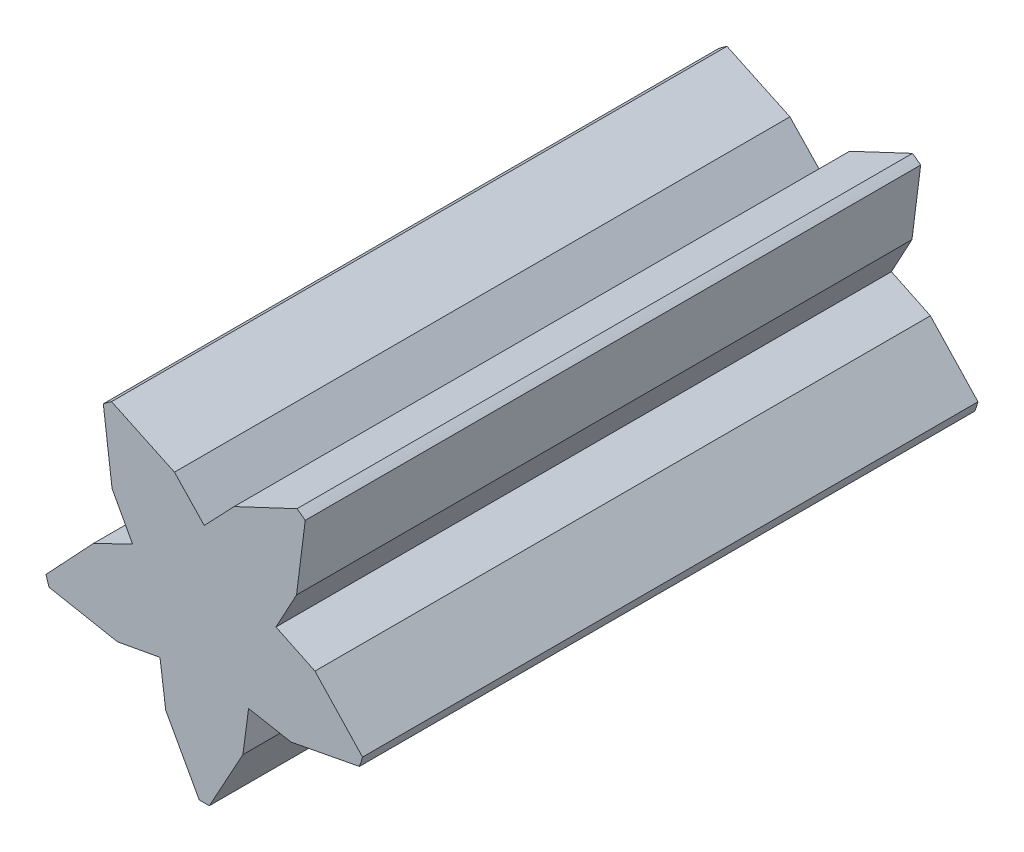
ISO-10303-21;
HEADER;
FILE_DESCRIPTION(('STEP AP214'),'2;1');
FILE_NAME('part.step','',(''),(''),'','','');
FILE_SCHEMA(('AUTOMOTIVE_DESIGN { 1 0 10303 214 1 1 1 1 }'));
ENDSEC;
DATA;
#1=APPLICATION_CONTEXT('core data for automotive mechanical design processes');
#2=APPLICATION_PROTOCOL_DEFINITION('international standard','automotive_design',2000,#1);
#3=PRODUCT_CONTEXT('',#1,'mechanical');
#4=PRODUCT('Part','Part','',(#3));
#5=PRODUCT_RELATED_PRODUCT_CATEGORY('part','',(#4));
#6=PRODUCT_DEFINITION_FORMATION('','',#4);
#7=PRODUCT_DEFINITION_CONTEXT('part definition',#1,'design');
#8=PRODUCT_DEFINITION('design','',#6,#7);
#9=PRODUCT_DEFINITION_SHAPE('','',#8);
#10=(LENGTH_UNIT() NAMED_UNIT(*) SI_UNIT(.MILLI.,.METRE.));
#11=(NAMED_UNIT(*) PLANE_ANGLE_UNIT() SI_UNIT($,.RADIAN.));
#12=(NAMED_UNIT(*) SI_UNIT($,.STERADIAN.) SOLID_ANGLE_UNIT());
#13=UNCERTAINTY_MEASURE_WITH_UNIT(LENGTH_MEASURE(1.E-05),#10,'distance_accuracy_value','');
#14=(GEOMETRIC_REPRESENTATION_CONTEXT(3) GLOBAL_UNCERTAINTY_ASSIGNED_CONTEXT((#13)) GLOBAL_UNIT_ASSIGNED_CONTEXT((#10,
#11,#12)) REPRESENTATION_CONTEXT('',''));
#15=CARTESIAN_POINT('',(0.,0.,0.));
#16=DIRECTION('',(0.,0.,1.));
#17=DIRECTION('',(1.,0.,0.));
#18=AXIS2_PLACEMENT_3D('',#15,#16,#17);
#19=CARTESIAN_POINT('',(0.,0.,28.));
#20=DIRECTION('',(0.,0.,-1.));
#21=DIRECTION('',(-1.,0.,0.));
#22=AXIS2_PLACEMENT_3D('',#19,#20,#21);
#23=CYLINDRICAL_SURFACE('',#22,7.5);
#24=DIRECTION('',(0.,0.,-1.));
#25=VECTOR('',#24,1.);
#26=CARTESIAN_POINT('',(7.20101602130368,-2.09651335815629,28.));
#27=LINE('',#26,#25);
#28=CARTESIAN_POINT('',(7.20101602130368,-2.09651335815629,28.));
#29=VERTEX_POINT('',#28);
#30=CARTESIAN_POINT('',(7.20101602130368,-2.09651335815629,0.));
#31=VERTEX_POINT('',#30);
#32=EDGE_CURVE('E312',#29,#31,#27,.T.);
#33=ORIENTED_EDGE('',*,*,#32,.F.);
#34=CARTESIAN_POINT('',(0.,0.,28.));
#35=DIRECTION('',(0.,0.,1.));
#36=DIRECTION('',(1.,0.,0.));
#37=AXIS2_PLACEMENT_3D('',#34,#35,#36);
#38=CIRCLE('',#37,7.5);
#39=CARTESIAN_POINT('',(7.05804397115943,-2.53653608316145,28.));
#40=VERTEX_POINT('',#39);
#41=EDGE_CURVE('E395',#40,#29,#38,.T.);
#42=ORIENTED_EDGE('',*,*,#41,.F.);
#43=DIRECTION('',(0.,0.,-1.));
#44=VECTOR('',#43,1.);
#45=CARTESIAN_POINT('',(7.05804397115943,-2.53653608316145,28.));
#46=LINE('',#45,#44);
#47=CARTESIAN_POINT('',(7.05804397115943,-2.53653608316145,0.));
#48=VERTEX_POINT('',#47);
#49=EDGE_CURVE('E281',#40,#48,#46,.T.);
#50=ORIENTED_EDGE('',*,*,#49,.T.);
#51=CARTESIAN_POINT('',(0.,0.,0.));
#52=DIRECTION('',(0.,0.,1.));
#53=DIRECTION('',(1.,0.,0.));
#54=AXIS2_PLACEMENT_3D('',#51,#52,#53);
#55=CIRCLE('',#54,7.5);
#56=EDGE_CURVE('E384',#48,#31,#55,.T.);
#57=ORIENTED_EDGE('',*,*,#56,.T.);
#58=EDGE_LOOP('',(#33,#42,#50,#57));
#59=FACE_BOUND('',#58,.T.);
#60=ADVANCED_FACE('F37',(#59),#23,.T.);
#61=DIRECTION('',(0.,0.,-1.));
#62=VECTOR('',#61,1.);
#63=CARTESIAN_POINT('',(4.59344470484238,5.92876595452676,28.));
#64=LINE('',#63,#62);
#65=CARTESIAN_POINT('',(4.59344470484238,5.92876595452676,28.));
#66=VERTEX_POINT('',#65);
#67=CARTESIAN_POINT('',(4.59344470484238,5.92876595452676,0.));
#68=VERTEX_POINT('',#67);
#69=EDGE_CURVE('E309',#66,#68,#64,.T.);
#70=ORIENTED_EDGE('',*,*,#69,.T.);
#71=CARTESIAN_POINT('',(4.21913901812355,6.20071495440223,0.));
#72=VERTEX_POINT('',#71);
#73=EDGE_CURVE('E381',#68,#72,#55,.T.);
#74=ORIENTED_EDGE('',*,*,#73,.T.);
#75=DIRECTION('',(0.,0.,-1.));
#76=VECTOR('',#75,1.);
#77=CARTESIAN_POINT('',(4.21913901812355,6.20071495440223,28.));
#78=LINE('',#77,#76);
#79=CARTESIAN_POINT('',(4.21913901812355,6.20071495440223,28.));
#80=VERTEX_POINT('',#79);
#81=EDGE_CURVE('E376',#80,#72,#78,.T.);
#82=ORIENTED_EDGE('',*,*,#81,.F.);
#83=EDGE_CURVE('E46',#66,#80,#38,.T.);
#84=ORIENTED_EDGE('',*,*,#83,.F.);
#85=EDGE_LOOP('',(#70,#74,#82,#84));
#86=FACE_BOUND('',#85,.T.);
#87=ADVANCED_FACE('F437',(#86),#23,.T.);
#88=DIRECTION('',(0.,0.,-1.));
#89=VECTOR('',#88,1.);
#90=CARTESIAN_POINT('',(0.231333636574714,-7.49643146761105,28.));
#91=LINE('',#90,#89);
#92=CARTESIAN_POINT('',(0.231333636574714,-7.49643146761105,28.));
#93=VERTEX_POINT('',#92);
#94=CARTESIAN_POINT('',(0.231333636574714,-7.49643146761105,0.));
#95=VERTEX_POINT('',#94);
#96=EDGE_CURVE('E284',#93,#95,#91,.T.);
#97=ORIENTED_EDGE('',*,*,#96,.F.);
#98=CARTESIAN_POINT('',(-0.231333636574606,-7.49643146761105,28.));
#99=VERTEX_POINT('',#98);
#100=EDGE_CURVE('E417',#99,#93,#38,.T.);
#101=ORIENTED_EDGE('',*,*,#100,.F.);
#102=DIRECTION('',(0.,0.,-1.));
#103=VECTOR('',#102,1.);
#104=CARTESIAN_POINT('',(-0.231333636574606,-7.49643146761105,28.));
#105=LINE('',#104,#103);
#106=CARTESIAN_POINT('',(-0.231333636574606,-7.49643146761105,0.));
#107=VERTEX_POINT('',#106);
#108=EDGE_CURVE('E254',#99,#107,#105,.T.);
#109=ORIENTED_EDGE('',*,*,#108,.T.);
#110=EDGE_CURVE('E389',#107,#95,#55,.T.);
#111=ORIENTED_EDGE('',*,*,#110,.T.);
#112=EDGE_LOOP('',(#97,#101,#109,#111));
#113=FACE_BOUND('',#112,.T.);
#114=ADVANCED_FACE('F403',(#113),#23,.T.);
#115=DIRECTION('',(0.,0.,-1.));
#116=VECTOR('',#115,1.);
#117=CARTESIAN_POINT('',(-7.05804397115939,-2.53653608316156,28.));
#118=LINE('',#117,#116);
#119=CARTESIAN_POINT('',(-7.05804397115939,-2.53653608316156,28.));
#120=VERTEX_POINT('',#119);
#121=CARTESIAN_POINT('',(-7.05804397115939,-2.53653608316156,0.));
#122=VERTEX_POINT('',#121);
#123=EDGE_CURVE('E229',#120,#122,#118,.T.);
#124=ORIENTED_EDGE('',*,*,#123,.F.);
#125=CARTESIAN_POINT('',(-7.20101602130365,-2.09651335815639,28.));
#126=VERTEX_POINT('',#125);
#127=EDGE_CURVE('E45',#126,#120,#38,.T.);
#128=ORIENTED_EDGE('',*,*,#127,.F.);
#129=DIRECTION('',(0.,0.,-1.));
#130=VECTOR('',#129,1.);
#131=CARTESIAN_POINT('',(-7.20101602130365,-2.09651335815639,28.));
#132=LINE('',#131,#130);
#133=CARTESIAN_POINT('',(-7.20101602130365,-2.09651335815639,0.));
#134=VERTEX_POINT('',#133);
#135=EDGE_CURVE('E339',#126,#134,#132,.T.);
#136=ORIENTED_EDGE('',*,*,#135,.T.);
#137=EDGE_CURVE('E391',#134,#122,#55,.T.);
#138=ORIENTED_EDGE('',*,*,#137,.T.);
#139=EDGE_LOOP('',(#124,#128,#136,#138));
#140=FACE_BOUND('',#139,.T.);
#141=ADVANCED_FACE('F466',(#140),#23,.T.);
#142=DIRECTION('',(0.,0.,-1.));
#143=VECTOR('',#142,1.);
#144=CARTESIAN_POINT('',(-4.59344470484246,5.92876595452669,28.));
#145=LINE('',#144,#143);
#146=CARTESIAN_POINT('',(-4.59344470484246,5.92876595452669,28.));
#147=VERTEX_POINT('',#146);
#148=CARTESIAN_POINT('',(-4.59344470484246,5.92876595452669,0.));
#149=VERTEX_POINT('',#148);
#150=EDGE_CURVE('E342',#147,#149,#145,.T.);
#151=ORIENTED_EDGE('',*,*,#150,.F.);
#152=CARTESIAN_POINT('',(-4.21913901812355,6.20071495440223,28.));
#153=VERTEX_POINT('',#152);
#154=EDGE_CURVE('E11',#153,#147,#38,.T.);
#155=ORIENTED_EDGE('',*,*,#154,.F.);
#156=DIRECTION('',(0.,0.,-1.));
#157=VECTOR('',#156,1.);
#158=CARTESIAN_POINT('',(-4.21913901812355,6.20071495440223,28.));
#159=LINE('',#158,#157);
#160=CARTESIAN_POINT('',(-4.21913901812355,6.20071495440223,0.));
#161=VERTEX_POINT('',#160);
#162=EDGE_CURVE('E373',#153,#161,#159,.T.);
#163=ORIENTED_EDGE('',*,*,#162,.T.);
#164=EDGE_CURVE('E40',#161,#149,#55,.T.);
#165=ORIENTED_EDGE('',*,*,#164,.T.);
#166=EDGE_LOOP('',(#151,#155,#163,#165));
#167=FACE_BOUND('',#166,.T.);
#168=ADVANCED_FACE('F452',(#167),#23,.T.);
#169=CARTESIAN_POINT('',(0.,0.,28.));
#170=DIRECTION('',(0.,0.,1.));
#171=DIRECTION('',(1.,0.,0.));
#172=AXIS2_PLACEMENT_3D('',#169,#170,#171);
#173=PLANE('',#172);
#174=ORIENTED_EDGE('',*,*,#41,.T.);
#175=DIRECTION('',(0.684710829113543,-0.728814846510857,0.));
#176=VECTOR('',#175,1.);
#177=CARTESIAN_POINT('',(5.03450760612941,0.209545536974573,28.));
#178=LINE('',#177,#176);
#179=CARTESIAN_POINT('',(5.03450760612941,0.209545536974573,28.));
#180=VERTEX_POINT('',#179);
#181=EDGE_CURVE('E289',#180,#29,#178,.T.);
#182=ORIENTED_EDGE('',*,*,#181,.F.);
#183=DIRECTION('',(0.901699966110062,-0.432362314635669,0.));
#184=VECTOR('',#183,1.);
#185=CARTESIAN_POINT('',(3.26146463479318,1.05971409841141,28.));
#186=LINE('',#185,#184);
#187=CARTESIAN_POINT('',(3.26146463479318,1.05971409841141,28.));
#188=VERTEX_POINT('',#187);
#189=EDGE_CURVE('E287',#188,#180,#186,.T.);
#190=ORIENTED_EDGE('',*,*,#189,.F.);
#191=DIRECTION('',(-0.47535440422045,-0.879794402339672,0.));
#192=VECTOR('',#191,1.);
#193=CARTESIAN_POINT('',(3.26146463479318,1.05971409841141,28.));
#194=LINE('',#193,#192);
#195=CARTESIAN_POINT('',(4.19616998798593,2.78968342292939,28.));
#196=VERTEX_POINT('',#195);
#197=EDGE_CURVE('E294',#196,#188,#194,.T.);
#198=ORIENTED_EDGE('',*,*,#197,.F.);
#199=DIRECTION('',(-0.12555607855451,-0.992086524017948,0.));
#200=VECTOR('',#199,1.);
#201=CARTESIAN_POINT('',(4.19616998798593,2.78968342292939,28.));
#202=LINE('',#201,#200);
#203=EDGE_CURVE('E292',#66,#196,#202,.T.);
#204=ORIENTED_EDGE('',*,*,#203,.F.);
#205=ORIENTED_EDGE('',*,*,#83,.T.);
#206=DIRECTION('',(0.904731391375453,0.425982522481658,0.));
#207=VECTOR('',#206,1.);
#208=CARTESIAN_POINT('',(1.35645876020374,4.85285439716745,28.));
#209=LINE('',#208,#207);
#210=CARTESIAN_POINT('',(1.35645876020374,4.85285439716745,28.));
#211=VERTEX_POINT('',#210);
#212=EDGE_CURVE('E350',#211,#80,#209,.T.);
#213=ORIENTED_EDGE('',*,*,#212,.F.);
#214=DIRECTION('',(0.68984161009004,0.723960325562376,0.));
#215=VECTOR('',#214,1.);
#216=CARTESIAN_POINT('',(0.,3.4293068591741,28.));
#217=LINE('',#216,#215);
#218=CARTESIAN_POINT('',(0.,3.4293068591741,28.));
#219=VERTEX_POINT('',#218);
#220=EDGE_CURVE('E348',#219,#211,#217,.T.);
#221=ORIENTED_EDGE('',*,*,#220,.F.);
#222=DIRECTION('',(0.68984161009004,-0.723960325562376,0.));
#223=VECTOR('',#222,1.);
#224=CARTESIAN_POINT('',(0.,3.4293068591741,28.));
#225=LINE('',#224,#223);
#226=CARTESIAN_POINT('',(-1.35645876020374,4.85285439716745,28.));
#227=VERTEX_POINT('',#226);
#228=EDGE_CURVE('E356',#227,#219,#225,.T.);
#229=ORIENTED_EDGE('',*,*,#228,.F.);
#230=DIRECTION('',(0.904731391375453,-0.425982522481658,0.));
#231=VECTOR('',#230,1.);
#232=CARTESIAN_POINT('',(-1.35645876020374,4.85285439716745,28.));
#233=LINE('',#232,#231);
#234=EDGE_CURVE('E354',#153,#227,#233,.T.);
#235=ORIENTED_EDGE('',*,*,#234,.F.);
#236=ORIENTED_EDGE('',*,*,#154,.T.);
#237=DIRECTION('',(-0.125556078554524,0.992086524017946,0.));
#238=VECTOR('',#237,1.);
#239=CARTESIAN_POINT('',(-4.19616998798597,2.78968342292934,28.));
#240=LINE('',#239,#238);
#241=CARTESIAN_POINT('',(-4.19616998798597,2.78968342292934,28.));
#242=VERTEX_POINT('',#241);
#243=EDGE_CURVE('E317',#242,#147,#240,.T.);
#244=ORIENTED_EDGE('',*,*,#243,.F.);
#245=DIRECTION('',(-0.475354404220463,0.879794402339665,0.));
#246=VECTOR('',#245,1.);
#247=CARTESIAN_POINT('',(-3.2614646347932,1.05971409841136,28.));
#248=LINE('',#247,#246);
#249=CARTESIAN_POINT('',(-3.2614646347932,1.05971409841136,28.));
#250=VERTEX_POINT('',#249);
#251=EDGE_CURVE('E315',#250,#242,#248,.T.);
#252=ORIENTED_EDGE('',*,*,#251,.F.);
#253=DIRECTION('',(0.901699966110056,0.432362314635682,0.));
#254=VECTOR('',#253,1.);
#255=CARTESIAN_POINT('',(-3.2614646347932,1.05971409841136,28.));
#256=LINE('',#255,#254);
#257=CARTESIAN_POINT('',(-5.03450760612942,0.209545536974502,28.));
#258=VERTEX_POINT('',#257);
#259=EDGE_CURVE('E322',#258,#250,#256,.T.);
#260=ORIENTED_EDGE('',*,*,#259,.F.);
#261=DIRECTION('',(0.684710829113533,0.728814846510867,0.));
#262=VECTOR('',#261,1.);
#263=CARTESIAN_POINT('',(-5.03450760612942,0.209545536974502,28.));
#264=LINE('',#263,#262);
#265=EDGE_CURVE('E320',#126,#258,#264,.T.);
#266=ORIENTED_EDGE('',*,*,#265,.F.);
#267=ORIENTED_EDGE('',*,*,#127,.T.);
#268=DIRECTION('',(-0.9823293154163,0.187160669142166,0.));
#269=VECTOR('',#268,1.);
#270=CARTESIAN_POINT('',(-3.94983443535129,-3.12873522394498,28.));
#271=LINE('',#270,#269);
#272=CARTESIAN_POINT('',(-3.94983443535129,-3.12873522394498,28.));
#273=VERTEX_POINT('',#272);
#274=EDGE_CURVE('E220',#273,#120,#271,.T.);
#275=ORIENTED_EDGE('',*,*,#274,.F.);
#276=DIRECTION('',(-0.98362678860024,-0.180217481804568,0.));
#277=VECTOR('',#276,1.);
#278=CARTESIAN_POINT('',(-2.01569599740794,-2.77436752799844,28.));
#279=LINE('',#278,#277);
#280=CARTESIAN_POINT('',(-2.01569599740794,-2.77436752799844,28.));
#281=VERTEX_POINT('',#280);
#282=EDGE_CURVE('E210',#281,#273,#279,.T.);
#283=ORIENTED_EDGE('',*,*,#282,.F.);
#284=DIRECTION('',(-0.132560383379402,0.991174931461801,0.));
#285=VECTOR('',#284,1.);
#286=CARTESIAN_POINT('',(-2.01569599740794,-2.77436752799844,28.));
#287=LINE('',#286,#285);
#288=CARTESIAN_POINT('',(-1.75503805700408,-4.72334813312636,28.));
#289=VERTEX_POINT('',#288);
#290=EDGE_CURVE('E238',#289,#281,#287,.T.);
#291=ORIENTED_EDGE('',*,*,#290,.F.);
#292=DIRECTION('',(-0.481556826518173,0.876414869130908,0.));
#293=VECTOR('',#292,1.);
#294=CARTESIAN_POINT('',(-1.75503805700408,-4.72334813312636,28.));
#295=LINE('',#294,#293);
#296=EDGE_CURVE('E236',#99,#289,#295,.T.);
#297=ORIENTED_EDGE('',*,*,#296,.F.);
#298=ORIENTED_EDGE('',*,*,#100,.T.);
#299=DIRECTION('',(-0.48155682651816,-0.876414869130915,0.));
#300=VECTOR('',#299,1.);
#301=CARTESIAN_POINT('',(1.75503805700415,-4.72334813312633,28.));
#302=LINE('',#301,#300);
#303=CARTESIAN_POINT('',(1.75503805700415,-4.72334813312633,28.));
#304=VERTEX_POINT('',#303);
#305=EDGE_CURVE('E260',#304,#93,#302,.T.);
#306=ORIENTED_EDGE('',*,*,#305,.F.);
#307=DIRECTION('',(-0.132560383379387,-0.991174931461803,0.));
#308=VECTOR('',#307,1.);
#309=CARTESIAN_POINT('',(2.01569599740798,-2.77436752799841,28.));
#310=LINE('',#309,#308);
#311=CARTESIAN_POINT('',(2.01569599740798,-2.77436752799841,28.));
#312=VERTEX_POINT('',#311);
#313=EDGE_CURVE('E258',#312,#304,#310,.T.);
#314=ORIENTED_EDGE('',*,*,#313,.F.);
#315=DIRECTION('',(-0.983626788600242,0.180217481804553,0.));
#316=VECTOR('',#315,1.);
#317=CARTESIAN_POINT('',(2.01569599740798,-2.77436752799841,28.));
#318=LINE('',#317,#316);
#319=CARTESIAN_POINT('',(3.94983443535133,-3.12873522394493,28.));
#320=VERTEX_POINT('',#319);
#321=EDGE_CURVE('E265',#320,#312,#318,.T.);
#322=ORIENTED_EDGE('',*,*,#321,.F.);
#323=DIRECTION('',(-0.982329315416297,-0.18716066914218,0.));
#324=VECTOR('',#323,1.);
#325=CARTESIAN_POINT('',(3.94983443535133,-3.12873522394493,28.));
#326=LINE('',#325,#324);
#327=EDGE_CURVE('E263',#40,#320,#326,.T.);
#328=ORIENTED_EDGE('',*,*,#327,.F.);
#329=EDGE_LOOP('',(#174,#182,#190,#198,#204,#205,#213,#221,#229,#235,#236,#244,#252,#260,#266,
#267,#275,#283,#291,#297,#298,#306,#314,#322,#328));
#330=FACE_BOUND('',#329,.T.);
#331=ADVANCED_FACE('F233',(#330),#173,.T.);
#332=CARTESIAN_POINT('',(0.,0.,0.));
#333=DIRECTION('',(0.,0.,1.));
#334=DIRECTION('',(1.,0.,0.));
#335=AXIS2_PLACEMENT_3D('',#332,#333,#334);
#336=PLANE('',#335);
#337=DIRECTION('',(0.684710829113543,-0.728814846510857,0.));
#338=VECTOR('',#337,1.);
#339=CARTESIAN_POINT('',(5.03450760612941,0.209545536974573,0.));
#340=LINE('',#339,#338);
#341=CARTESIAN_POINT('',(5.03450760612941,0.209545536974573,0.));
#342=VERTEX_POINT('',#341);
#343=EDGE_CURVE('E298',#342,#31,#340,.T.);
#344=ORIENTED_EDGE('',*,*,#343,.T.);
#345=ORIENTED_EDGE('',*,*,#56,.F.);
#346=DIRECTION('',(-0.982329315416297,-0.18716066914218,0.));
#347=VECTOR('',#346,1.);
#348=CARTESIAN_POINT('',(3.94983443535133,-3.12873522394493,0.));
#349=LINE('',#348,#347);
#350=CARTESIAN_POINT('',(3.94983443535133,-3.12873522394493,0.));
#351=VERTEX_POINT('',#350);
#352=EDGE_CURVE('E273',#48,#351,#349,.T.);
#353=ORIENTED_EDGE('',*,*,#352,.T.);
#354=DIRECTION('',(-0.983626788600242,0.180217481804553,0.));
#355=VECTOR('',#354,1.);
#356=CARTESIAN_POINT('',(2.01569599740798,-2.77436752799841,0.));
#357=LINE('',#356,#355);
#358=CARTESIAN_POINT('',(2.01569599740798,-2.77436752799841,0.));
#359=VERTEX_POINT('',#358);
#360=EDGE_CURVE('E261',#351,#359,#357,.T.);
#361=ORIENTED_EDGE('',*,*,#360,.T.);
#362=DIRECTION('',(-0.132560383379387,-0.991174931461803,0.));
#363=VECTOR('',#362,1.);
#364=CARTESIAN_POINT('',(2.01569599740798,-2.77436752799841,0.));
#365=LINE('',#364,#363);
#366=CARTESIAN_POINT('',(1.75503805700415,-4.72334813312633,0.));
#367=VERTEX_POINT('',#366);
#368=EDGE_CURVE('E61',#359,#367,#365,.T.);
#369=ORIENTED_EDGE('',*,*,#368,.T.);
#370=DIRECTION('',(-0.48155682651816,-0.876414869130915,0.));
#371=VECTOR('',#370,1.);
#372=CARTESIAN_POINT('',(1.75503805700415,-4.72334813312633,0.));
#373=LINE('',#372,#371);
#374=EDGE_CURVE('E269',#367,#95,#373,.T.);
#375=ORIENTED_EDGE('',*,*,#374,.T.);
#376=ORIENTED_EDGE('',*,*,#110,.F.);
#377=DIRECTION('',(-0.481556826518173,0.876414869130908,0.));
#378=VECTOR('',#377,1.);
#379=CARTESIAN_POINT('',(-1.75503805700408,-4.72334813312636,0.));
#380=LINE('',#379,#378);
#381=CARTESIAN_POINT('',(-1.75503805700408,-4.72334813312636,0.));
#382=VERTEX_POINT('',#381);
#383=EDGE_CURVE('E246',#107,#382,#380,.T.);
#384=ORIENTED_EDGE('',*,*,#383,.T.);
#385=DIRECTION('',(-0.132560383379402,0.991174931461801,0.));
#386=VECTOR('',#385,1.);
#387=CARTESIAN_POINT('',(-2.01569599740794,-2.77436752799844,0.));
#388=LINE('',#387,#386);
#389=CARTESIAN_POINT('',(-2.01569599740794,-2.77436752799844,0.));
#390=VERTEX_POINT('',#389);
#391=EDGE_CURVE('E221',#382,#390,#388,.T.);
#392=ORIENTED_EDGE('',*,*,#391,.T.);
#393=DIRECTION('',(-0.98362678860024,-0.180217481804568,0.));
#394=VECTOR('',#393,1.);
#395=CARTESIAN_POINT('',(-2.01569599740794,-2.77436752799844,0.));
#396=LINE('',#395,#394);
#397=CARTESIAN_POINT('',(-3.94983443535129,-3.12873522394498,0.));
#398=VERTEX_POINT('',#397);
#399=EDGE_CURVE('E242',#390,#398,#396,.T.);
#400=ORIENTED_EDGE('',*,*,#399,.T.);
#401=DIRECTION('',(-0.9823293154163,0.187160669142166,0.));
#402=VECTOR('',#401,1.);
#403=CARTESIAN_POINT('',(-3.94983443535129,-3.12873522394498,0.));
#404=LINE('',#403,#402);
#405=EDGE_CURVE('E227',#398,#122,#404,.T.);
#406=ORIENTED_EDGE('',*,*,#405,.T.);
#407=ORIENTED_EDGE('',*,*,#137,.F.);
#408=DIRECTION('',(0.684710829113533,0.728814846510867,0.));
#409=VECTOR('',#408,1.);
#410=CARTESIAN_POINT('',(-5.03450760612942,0.209545536974502,0.));
#411=LINE('',#410,#409);
#412=CARTESIAN_POINT('',(-5.03450760612942,0.209545536974502,0.));
#413=VERTEX_POINT('',#412);
#414=EDGE_CURVE('E330',#134,#413,#411,.T.);
#415=ORIENTED_EDGE('',*,*,#414,.T.);
#416=DIRECTION('',(0.901699966110056,0.432362314635682,0.));
#417=VECTOR('',#416,1.);
#418=CARTESIAN_POINT('',(-3.2614646347932,1.05971409841136,0.));
#419=LINE('',#418,#417);
#420=CARTESIAN_POINT('',(-3.2614646347932,1.05971409841136,0.));
#421=VERTEX_POINT('',#420);
#422=EDGE_CURVE('E318',#413,#421,#419,.T.);
#423=ORIENTED_EDGE('',*,*,#422,.T.);
#424=DIRECTION('',(-0.475354404220463,0.879794402339665,0.));
#425=VECTOR('',#424,1.);
#426=CARTESIAN_POINT('',(-3.2614646347932,1.05971409841136,0.));
#427=LINE('',#426,#425);
#428=CARTESIAN_POINT('',(-4.19616998798597,2.78968342292934,0.));
#429=VERTEX_POINT('',#428);
#430=EDGE_CURVE('E228',#421,#429,#427,.T.);
#431=ORIENTED_EDGE('',*,*,#430,.T.);
#432=DIRECTION('',(-0.125556078554524,0.992086524017946,0.));
#433=VECTOR('',#432,1.);
#434=CARTESIAN_POINT('',(-4.19616998798597,2.78968342292934,0.));
#435=LINE('',#434,#433);
#436=EDGE_CURVE('E327',#429,#149,#435,.T.);
#437=ORIENTED_EDGE('',*,*,#436,.T.);
#438=ORIENTED_EDGE('',*,*,#164,.F.);
#439=DIRECTION('',(0.904731391375453,-0.425982522481658,0.));
#440=VECTOR('',#439,1.);
#441=CARTESIAN_POINT('',(-1.35645876020374,4.85285439716745,0.));
#442=LINE('',#441,#440);
#443=CARTESIAN_POINT('',(-1.35645876020374,4.85285439716745,0.));
#444=VERTEX_POINT('',#443);
#445=EDGE_CURVE('E364',#161,#444,#442,.T.);
#446=ORIENTED_EDGE('',*,*,#445,.T.);
#447=DIRECTION('',(0.68984161009004,-0.723960325562376,0.));
#448=VECTOR('',#447,1.);
#449=CARTESIAN_POINT('',(0.,3.4293068591741,0.));
#450=LINE('',#449,#448);
#451=CARTESIAN_POINT('',(0.,3.4293068591741,0.));
#452=VERTEX_POINT('',#451);
#453=EDGE_CURVE('E351',#444,#452,#450,.T.);
#454=ORIENTED_EDGE('',*,*,#453,.T.);
#455=DIRECTION('',(0.68984161009004,0.723960325562376,0.));
#456=VECTOR('',#455,1.);
#457=CARTESIAN_POINT('',(0.,3.4293068591741,0.));
#458=LINE('',#457,#456);
#459=CARTESIAN_POINT('',(1.35645876020374,4.85285439716745,0.));
#460=VERTEX_POINT('',#459);
#461=EDGE_CURVE('E347',#452,#460,#458,.T.);
#462=ORIENTED_EDGE('',*,*,#461,.T.);
#463=DIRECTION('',(0.904731391375453,0.425982522481658,0.));
#464=VECTOR('',#463,1.);
#465=CARTESIAN_POINT('',(1.35645876020374,4.85285439716745,0.));
#466=LINE('',#465,#464);
#467=EDGE_CURVE('E361',#460,#72,#466,.T.);
#468=ORIENTED_EDGE('',*,*,#467,.T.);
#469=ORIENTED_EDGE('',*,*,#73,.F.);
#470=DIRECTION('',(-0.12555607855451,-0.992086524017948,0.));
#471=VECTOR('',#470,1.);
#472=CARTESIAN_POINT('',(4.19616998798593,2.78968342292939,0.));
#473=LINE('',#472,#471);
#474=CARTESIAN_POINT('',(4.19616998798593,2.78968342292939,0.));
#475=VERTEX_POINT('',#474);
#476=EDGE_CURVE('E301',#68,#475,#473,.T.);
#477=ORIENTED_EDGE('',*,*,#476,.T.);
#478=DIRECTION('',(-0.47535440422045,-0.879794402339672,0.));
#479=VECTOR('',#478,1.);
#480=CARTESIAN_POINT('',(3.26146463479318,1.05971409841141,0.));
#481=LINE('',#480,#479);
#482=CARTESIAN_POINT('',(3.26146463479319,1.05971409841141,0.));
#483=VERTEX_POINT('',#482);
#484=EDGE_CURVE('E290',#475,#483,#481,.T.);
#485=ORIENTED_EDGE('',*,*,#484,.T.);
#486=DIRECTION('',(0.901699966110062,-0.432362314635669,0.));
#487=VECTOR('',#486,1.);
#488=CARTESIAN_POINT('',(3.26146463479318,1.05971409841141,0.));
#489=LINE('',#488,#487);
#490=EDGE_CURVE('E53',#483,#342,#489,.T.);
#491=ORIENTED_EDGE('',*,*,#490,.T.);
#492=EDGE_LOOP('',(#344,#345,#353,#361,#369,#375,#376,#384,#392,#400,#406,#407,#415,#423,#431,
#437,#438,#446,#454,#462,#468,#469,#477,#485,#491));
#493=FACE_BOUND('',#492,.T.);
#494=ADVANCED_FACE('F407',(#493),#336,.F.);
#495=CARTESIAN_POINT('',(0.,3.4293068591741,28.));
#496=DIRECTION('',(-0.723960325562376,0.68984161009004,0.));
#497=DIRECTION('',(-0.68984161009004,-0.723960325562376,0.));
#498=AXIS2_PLACEMENT_3D('',#495,#496,#497);
#499=PLANE('',#498);
#500=ORIENTED_EDGE('',*,*,#461,.F.);
#501=DIRECTION('',(0.,0.,-1.));
#502=VECTOR('',#501,1.);
#503=CARTESIAN_POINT('',(0.,3.4293068591741,28.));
#504=LINE('',#503,#502);
#505=EDGE_CURVE('E358',#219,#452,#504,.T.);
#506=ORIENTED_EDGE('',*,*,#505,.F.);
#507=ORIENTED_EDGE('',*,*,#220,.T.);
#508=DIRECTION('',(0.,0.,-1.));
#509=VECTOR('',#508,1.);
#510=CARTESIAN_POINT('',(1.35645876020374,4.85285439716745,28.));
#511=LINE('',#510,#509);
#512=EDGE_CURVE('E379',#211,#460,#511,.T.);
#513=ORIENTED_EDGE('',*,*,#512,.T.);
#514=EDGE_LOOP('',(#500,#506,#507,#513));
#515=FACE_BOUND('',#514,.T.);
#516=ADVANCED_FACE('F442',(#515),#499,.T.);
#517=CARTESIAN_POINT('',(1.35645876020374,4.85285439716745,28.));
#518=DIRECTION('',(-0.425982522481658,0.904731391375453,0.));
#519=DIRECTION('',(-0.904731391375453,-0.425982522481659,0.));
#520=AXIS2_PLACEMENT_3D('',#517,#518,#519);
#521=PLANE('',#520);
#522=ORIENTED_EDGE('',*,*,#467,.F.);
#523=ORIENTED_EDGE('',*,*,#512,.F.);
#524=ORIENTED_EDGE('',*,*,#212,.T.);
#525=ORIENTED_EDGE('',*,*,#81,.T.);
#526=EDGE_LOOP('',(#522,#523,#524,#525));
#527=FACE_BOUND('',#526,.T.);
#528=ADVANCED_FACE('F439',(#527),#521,.T.);
#529=CARTESIAN_POINT('',(-1.35645876020374,4.85285439716745,28.));
#530=DIRECTION('',(0.425982522481658,0.904731391375453,0.));
#531=DIRECTION('',(-0.904731391375453,0.425982522481659,0.));
#532=AXIS2_PLACEMENT_3D('',#529,#530,#531);
#533=PLANE('',#532);
#534=ORIENTED_EDGE('',*,*,#445,.F.);
#535=ORIENTED_EDGE('',*,*,#162,.F.);
#536=ORIENTED_EDGE('',*,*,#234,.T.);
#537=DIRECTION('',(0.,0.,-1.));
#538=VECTOR('',#537,1.);
#539=CARTESIAN_POINT('',(-1.35645876020374,4.85285439716745,28.));
#540=LINE('',#539,#538);
#541=EDGE_CURVE('E371',#227,#444,#540,.T.);
#542=ORIENTED_EDGE('',*,*,#541,.T.);
#543=EDGE_LOOP('',(#534,#535,#536,#542));
#544=FACE_BOUND('',#543,.T.);
#545=ADVANCED_FACE('F514',(#544),#533,.T.);
#546=CARTESIAN_POINT('',(0.,3.4293068591741,28.));
#547=DIRECTION('',(0.723960325562376,0.68984161009004,0.));
#548=DIRECTION('',(-0.68984161009004,0.723960325562376,0.));
#549=AXIS2_PLACEMENT_3D('',#546,#547,#548);
#550=PLANE('',#549);
#551=ORIENTED_EDGE('',*,*,#453,.F.);
#552=ORIENTED_EDGE('',*,*,#541,.F.);
#553=ORIENTED_EDGE('',*,*,#228,.T.);
#554=ORIENTED_EDGE('',*,*,#505,.T.);
#555=EDGE_LOOP('',(#551,#552,#553,#554));
#556=FACE_BOUND('',#555,.T.);
#557=ADVANCED_FACE('F445',(#556),#550,.T.);
#558=CARTESIAN_POINT('',(-3.2614646347932,1.05971409841136,28.));
#559=DIRECTION('',(-0.879794402339665,-0.475354404220463,0.));
#560=DIRECTION('',(0.475354404220463,-0.879794402339665,0.));
#561=AXIS2_PLACEMENT_3D('',#558,#559,#560);
#562=PLANE('',#561);
#563=ORIENTED_EDGE('',*,*,#430,.F.);
#564=DIRECTION('',(0.,0.,-1.));
#565=VECTOR('',#564,1.);
#566=CARTESIAN_POINT('',(-3.2614646347932,1.05971409841136,28.));
#567=LINE('',#566,#565);
#568=EDGE_CURVE('E324',#250,#421,#567,.T.);
#569=ORIENTED_EDGE('',*,*,#568,.F.);
#570=ORIENTED_EDGE('',*,*,#251,.T.);
#571=DIRECTION('',(0.,0.,-1.));
#572=VECTOR('',#571,1.);
#573=CARTESIAN_POINT('',(-4.19616998798597,2.78968342292934,28.));
#574=LINE('',#573,#572);
#575=EDGE_CURVE('E344',#242,#429,#574,.T.);
#576=ORIENTED_EDGE('',*,*,#575,.T.);
#577=EDGE_LOOP('',(#563,#569,#570,#576));
#578=FACE_BOUND('',#577,.T.);
#579=ADVANCED_FACE('F459',(#578),#562,.T.);
#580=CARTESIAN_POINT('',(-4.19616998798597,2.78968342292934,28.));
#581=DIRECTION('',(-0.992086524017946,-0.125556078554524,0.));
#582=DIRECTION('',(0.125556078554524,-0.992086524017946,0.));
#583=AXIS2_PLACEMENT_3D('',#580,#581,#582);
#584=PLANE('',#583);
#585=ORIENTED_EDGE('',*,*,#436,.F.);
#586=ORIENTED_EDGE('',*,*,#575,.F.);
#587=ORIENTED_EDGE('',*,*,#243,.T.);
#588=ORIENTED_EDGE('',*,*,#150,.T.);
#589=EDGE_LOOP('',(#585,#586,#587,#588));
#590=FACE_BOUND('',#589,.T.);
#591=ADVANCED_FACE('F454',(#590),#584,.T.);
#592=CARTESIAN_POINT('',(-5.03450760612942,0.209545536974502,28.));
#593=DIRECTION('',(-0.728814846510867,0.684710829113533,0.));
#594=DIRECTION('',(-0.684710829113533,-0.728814846510867,0.));
#595=AXIS2_PLACEMENT_3D('',#592,#593,#594);
#596=PLANE('',#595);
#597=ORIENTED_EDGE('',*,*,#414,.F.);
#598=ORIENTED_EDGE('',*,*,#135,.F.);
#599=ORIENTED_EDGE('',*,*,#265,.T.);
#600=DIRECTION('',(0.,0.,-1.));
#601=VECTOR('',#600,1.);
#602=CARTESIAN_POINT('',(-5.03450760612942,0.209545536974502,28.));
#603=LINE('',#602,#601);
#604=EDGE_CURVE('E337',#258,#413,#603,.T.);
#605=ORIENTED_EDGE('',*,*,#604,.T.);
#606=EDGE_LOOP('',(#597,#598,#599,#605));
#607=FACE_BOUND('',#606,.T.);
#608=ADVANCED_FACE('F577',(#607),#596,.T.);
#609=CARTESIAN_POINT('',(-3.2614646347932,1.05971409841136,28.));
#610=DIRECTION('',(-0.432362314635681,0.901699966110056,0.));
#611=DIRECTION('',(-0.901699966110056,-0.432362314635681,0.));
#612=AXIS2_PLACEMENT_3D('',#609,#610,#611);
#613=PLANE('',#612);
#614=ORIENTED_EDGE('',*,*,#422,.F.);
#615=ORIENTED_EDGE('',*,*,#604,.F.);
#616=ORIENTED_EDGE('',*,*,#259,.T.);
#617=ORIENTED_EDGE('',*,*,#568,.T.);
#618=EDGE_LOOP('',(#614,#615,#616,#617));
#619=FACE_BOUND('',#618,.T.);
#620=ADVANCED_FACE('F462',(#619),#613,.T.);
#621=CARTESIAN_POINT('',(-2.01569599740794,-2.77436752799844,28.));
#622=DIRECTION('',(0.180217481804568,-0.98362678860024,0.));
#623=DIRECTION('',(0.98362678860024,0.180217481804568,0.));
#624=AXIS2_PLACEMENT_3D('',#621,#622,#623);
#625=PLANE('',#624);
#626=ORIENTED_EDGE('',*,*,#399,.F.);
#627=DIRECTION('',(0.,0.,-1.));
#628=VECTOR('',#627,1.);
#629=CARTESIAN_POINT('',(-2.01569599740794,-2.77436752799844,28.));
#630=LINE('',#629,#628);
#631=EDGE_CURVE('E216',#281,#390,#630,.T.);
#632=ORIENTED_EDGE('',*,*,#631,.F.);
#633=ORIENTED_EDGE('',*,*,#282,.T.);
#634=DIRECTION('',(0.,0.,-1.));
#635=VECTOR('',#634,1.);
#636=CARTESIAN_POINT('',(-3.94983443535129,-3.12873522394498,28.));
#637=LINE('',#636,#635);
#638=EDGE_CURVE('E213',#273,#398,#637,.T.);
#639=ORIENTED_EDGE('',*,*,#638,.T.);
#640=EDGE_LOOP('',(#626,#632,#633,#639));
#641=FACE_BOUND('',#640,.T.);
#642=ADVANCED_FACE('F212',(#641),#625,.T.);
#643=CARTESIAN_POINT('',(-3.94983443535129,-3.12873522394498,28.));
#644=DIRECTION('',(-0.187160669142166,-0.9823293154163,0.));
#645=DIRECTION('',(0.9823293154163,-0.187160669142166,0.));
#646=AXIS2_PLACEMENT_3D('',#643,#644,#645);
#647=PLANE('',#646);
#648=ORIENTED_EDGE('',*,*,#405,.F.);
#649=ORIENTED_EDGE('',*,*,#638,.F.);
#650=ORIENTED_EDGE('',*,*,#274,.T.);
#651=ORIENTED_EDGE('',*,*,#123,.T.);
#652=EDGE_LOOP('',(#648,#649,#650,#651));
#653=FACE_BOUND('',#652,.T.);
#654=ADVANCED_FACE('F224',(#653),#647,.T.);
#655=CARTESIAN_POINT('',(-1.75503805700408,-4.72334813312636,28.));
#656=DIRECTION('',(-0.876414869130908,-0.481556826518173,0.));
#657=DIRECTION('',(0.481556826518173,-0.876414869130908,0.));
#658=AXIS2_PLACEMENT_3D('',#655,#656,#657);
#659=PLANE('',#658);
#660=ORIENTED_EDGE('',*,*,#383,.F.);
#661=ORIENTED_EDGE('',*,*,#108,.F.);
#662=ORIENTED_EDGE('',*,*,#296,.T.);
#663=DIRECTION('',(0.,0.,-1.));
#664=VECTOR('',#663,1.);
#665=CARTESIAN_POINT('',(-1.75503805700408,-4.72334813312636,28.));
#666=LINE('',#665,#664);
#667=EDGE_CURVE('E252',#289,#382,#666,.T.);
#668=ORIENTED_EDGE('',*,*,#667,.T.);
#669=EDGE_LOOP('',(#660,#661,#662,#668));
#670=FACE_BOUND('',#669,.T.);
#671=ADVANCED_FACE('F472',(#670),#659,.T.);
#672=CARTESIAN_POINT('',(-2.01569599740794,-2.77436752799844,28.));
#673=DIRECTION('',(-0.991174931461801,-0.132560383379402,0.));
#674=DIRECTION('',(0.132560383379402,-0.991174931461801,0.));
#675=AXIS2_PLACEMENT_3D('',#672,#673,#674);
#676=PLANE('',#675);
#677=ORIENTED_EDGE('',*,*,#391,.F.);
#678=ORIENTED_EDGE('',*,*,#667,.F.);
#679=ORIENTED_EDGE('',*,*,#290,.T.);
#680=ORIENTED_EDGE('',*,*,#631,.T.);
#681=EDGE_LOOP('',(#677,#678,#679,#680));
#682=FACE_BOUND('',#681,.T.);
#683=ADVANCED_FACE('F469',(#682),#676,.T.);
#684=CARTESIAN_POINT('',(2.01569599740798,-2.77436752799841,28.));
#685=DIRECTION('',(0.991174931461803,-0.132560383379387,0.));
#686=DIRECTION('',(0.132560383379387,0.991174931461803,0.));
#687=AXIS2_PLACEMENT_3D('',#684,#685,#686);
#688=PLANE('',#687);
#689=ORIENTED_EDGE('',*,*,#368,.F.);
#690=DIRECTION('',(0.,0.,-1.));
#691=VECTOR('',#690,1.);
#692=CARTESIAN_POINT('',(2.01569599740798,-2.77436752799841,28.));
#693=LINE('',#692,#691);
#694=EDGE_CURVE('E267',#312,#359,#693,.T.);
#695=ORIENTED_EDGE('',*,*,#694,.F.);
#696=ORIENTED_EDGE('',*,*,#313,.T.);
#697=DIRECTION('',(0.,0.,-1.));
#698=VECTOR('',#697,1.);
#699=CARTESIAN_POINT('',(1.75503805700415,-4.72334813312633,28.));
#700=LINE('',#699,#698);
#701=EDGE_CURVE('E244',#304,#367,#700,.T.);
#702=ORIENTED_EDGE('',*,*,#701,.T.);
#703=EDGE_LOOP('',(#689,#695,#696,#702));
#704=FACE_BOUND('',#703,.T.);
#705=ADVANCED_FACE('F412',(#704),#688,.T.);
#706=CARTESIAN_POINT('',(1.75503805700415,-4.72334813312633,28.));
#707=DIRECTION('',(0.876414869130915,-0.48155682651816,0.));
#708=DIRECTION('',(0.48155682651816,0.876414869130915,0.));
#709=AXIS2_PLACEMENT_3D('',#706,#707,#708);
#710=PLANE('',#709);
#711=ORIENTED_EDGE('',*,*,#374,.F.);
#712=ORIENTED_EDGE('',*,*,#701,.F.);
#713=ORIENTED_EDGE('',*,*,#305,.T.);
#714=ORIENTED_EDGE('',*,*,#96,.T.);
#715=EDGE_LOOP('',(#711,#712,#713,#714));
#716=FACE_BOUND('',#715,.T.);
#717=ADVANCED_FACE('F410',(#716),#710,.T.);
#718=CARTESIAN_POINT('',(3.94983443535133,-3.12873522394493,28.));
#719=DIRECTION('',(0.18716066914218,-0.982329315416297,0.));
#720=DIRECTION('',(0.982329315416297,0.18716066914218,0.));
#721=AXIS2_PLACEMENT_3D('',#718,#719,#720);
#722=PLANE('',#721);
#723=ORIENTED_EDGE('',*,*,#352,.F.);
#724=ORIENTED_EDGE('',*,*,#49,.F.);
#725=ORIENTED_EDGE('',*,*,#327,.T.);
#726=DIRECTION('',(0.,0.,-1.));
#727=VECTOR('',#726,1.);
#728=CARTESIAN_POINT('',(3.94983443535133,-3.12873522394493,28.));
#729=LINE('',#728,#727);
#730=EDGE_CURVE('E279',#320,#351,#729,.T.);
#731=ORIENTED_EDGE('',*,*,#730,.T.);
#732=EDGE_LOOP('',(#723,#724,#725,#731));
#733=FACE_BOUND('',#732,.T.);
#734=ADVANCED_FACE('F634',(#733),#722,.T.);
#735=CARTESIAN_POINT('',(2.01569599740798,-2.77436752799841,28.));
#736=DIRECTION('',(-0.180217481804554,-0.983626788600242,0.));
#737=DIRECTION('',(0.983626788600242,-0.180217481804554,0.));
#738=AXIS2_PLACEMENT_3D('',#735,#736,#737);
#739=PLANE('',#738);
#740=ORIENTED_EDGE('',*,*,#360,.F.);
#741=ORIENTED_EDGE('',*,*,#730,.F.);
#742=ORIENTED_EDGE('',*,*,#321,.T.);
#743=ORIENTED_EDGE('',*,*,#694,.T.);
#744=EDGE_LOOP('',(#740,#741,#742,#743));
#745=FACE_BOUND('',#744,.T.);
#746=ADVANCED_FACE('F643',(#745),#739,.T.);
#747=CARTESIAN_POINT('',(3.26146463479318,1.05971409841141,28.));
#748=DIRECTION('',(0.432362314635669,0.901699966110062,0.));
#749=DIRECTION('',(-0.901699966110062,0.432362314635669,0.));
#750=AXIS2_PLACEMENT_3D('',#747,#748,#749);
#751=PLANE('',#750);
#752=ORIENTED_EDGE('',*,*,#490,.F.);
#753=DIRECTION('',(0.,0.,-1.));
#754=VECTOR('',#753,1.);
#755=CARTESIAN_POINT('',(3.26146463479318,1.05971409841141,28.));
#756=LINE('',#755,#754);
#757=EDGE_CURVE('E296',#188,#483,#756,.T.);
#758=ORIENTED_EDGE('',*,*,#757,.F.);
#759=ORIENTED_EDGE('',*,*,#189,.T.);
#760=DIRECTION('',(0.,0.,-1.));
#761=VECTOR('',#760,1.);
#762=CARTESIAN_POINT('',(5.03450760612941,0.209545536974573,28.));
#763=LINE('',#762,#761);
#764=EDGE_CURVE('E270',#180,#342,#763,.T.);
#765=ORIENTED_EDGE('',*,*,#764,.T.);
#766=EDGE_LOOP('',(#752,#758,#759,#765));
#767=FACE_BOUND('',#766,.T.);
#768=ADVANCED_FACE('F432',(#767),#751,.T.);
#769=CARTESIAN_POINT('',(5.03450760612941,0.209545536974573,28.));
#770=DIRECTION('',(0.728814846510857,0.684710829113543,0.));
#771=DIRECTION('',(-0.684710829113543,0.728814846510857,0.));
#772=AXIS2_PLACEMENT_3D('',#769,#770,#771);
#773=PLANE('',#772);
#774=ORIENTED_EDGE('',*,*,#343,.F.);
#775=ORIENTED_EDGE('',*,*,#764,.F.);
#776=ORIENTED_EDGE('',*,*,#181,.T.);
#777=ORIENTED_EDGE('',*,*,#32,.T.);
#778=EDGE_LOOP('',(#774,#775,#776,#777));
#779=FACE_BOUND('',#778,.T.);
#780=ADVANCED_FACE('F425',(#779),#773,.T.);
#781=CARTESIAN_POINT('',(4.19616998798593,2.78968342292939,28.));
#782=DIRECTION('',(0.992086524017948,-0.12555607855451,0.));
#783=DIRECTION('',(0.12555607855451,0.992086524017948,0.));
#784=AXIS2_PLACEMENT_3D('',#781,#782,#783);
#785=PLANE('',#784);
#786=ORIENTED_EDGE('',*,*,#476,.F.);
#787=ORIENTED_EDGE('',*,*,#69,.F.);
#788=ORIENTED_EDGE('',*,*,#203,.T.);
#789=DIRECTION('',(0.,0.,-1.));
#790=VECTOR('',#789,1.);
#791=CARTESIAN_POINT('',(4.19616998798593,2.78968342292939,28.));
#792=LINE('',#791,#790);
#793=EDGE_CURVE('E307',#196,#475,#792,.T.);
#794=ORIENTED_EDGE('',*,*,#793,.T.);
#795=EDGE_LOOP('',(#786,#787,#788,#794));
#796=FACE_BOUND('',#795,.T.);
#797=ADVANCED_FACE('F670',(#796),#785,.T.);
#798=CARTESIAN_POINT('',(3.26146463479318,1.05971409841141,28.));
#799=DIRECTION('',(0.879794402339672,-0.47535440422045,0.));
#800=DIRECTION('',(0.47535440422045,0.879794402339672,0.));
#801=AXIS2_PLACEMENT_3D('',#798,#799,#800);
#802=PLANE('',#801);
#803=ORIENTED_EDGE('',*,*,#484,.F.);
#804=ORIENTED_EDGE('',*,*,#793,.F.);
#805=ORIENTED_EDGE('',*,*,#197,.T.);
#806=ORIENTED_EDGE('',*,*,#757,.T.);
#807=EDGE_LOOP('',(#803,#804,#805,#806));
#808=FACE_BOUND('',#807,.T.);
#809=ADVANCED_FACE('F430',(#808),#802,.T.);
#810=CLOSED_SHELL('',(#60,#87,#114,#141,#168,#331,#494,#516,#528,#545,#557,#579,#591,#608,#620,
#642,#654,#671,#683,#705,#717,#734,#746,#768,#780,#797,#809));
#811=MANIFOLD_SOLID_BREP('B2',#810);
#812=ADVANCED_BREP_SHAPE_REPRESENTATION('',(#18,#811),#14);
#813=SHAPE_DEFINITION_REPRESENTATION(#9,#812);
ENDSEC;
END-ISO-10303-21;
